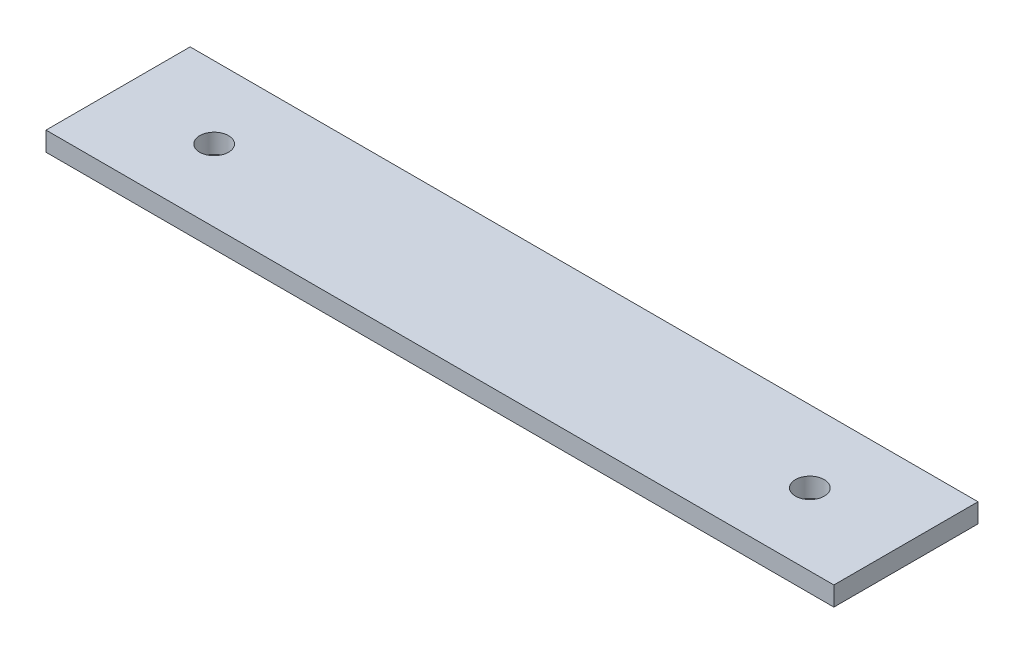
ISO-10303-21;
HEADER;
FILE_DESCRIPTION(('STEP AP214'),'2;1');
FILE_NAME('part.step','',(''),(''),'','','');
FILE_SCHEMA(('AUTOMOTIVE_DESIGN { 1 0 10303 214 1 1 1 1 }'));
ENDSEC;
DATA;
#1=APPLICATION_CONTEXT('core data for automotive mechanical design processes');
#2=APPLICATION_PROTOCOL_DEFINITION('international standard','automotive_design',2000,#1);
#3=PRODUCT_CONTEXT('',#1,'mechanical');
#4=PRODUCT('Part','Part','',(#3));
#5=PRODUCT_RELATED_PRODUCT_CATEGORY('part','',(#4));
#6=PRODUCT_DEFINITION_FORMATION('','',#4);
#7=PRODUCT_DEFINITION_CONTEXT('part definition',#1,'design');
#8=PRODUCT_DEFINITION('design','',#6,#7);
#9=PRODUCT_DEFINITION_SHAPE('','',#8);
#10=(LENGTH_UNIT() NAMED_UNIT(*) SI_UNIT(.MILLI.,.METRE.));
#11=(NAMED_UNIT(*) PLANE_ANGLE_UNIT() SI_UNIT($,.RADIAN.));
#12=(NAMED_UNIT(*) SI_UNIT($,.STERADIAN.) SOLID_ANGLE_UNIT());
#13=UNCERTAINTY_MEASURE_WITH_UNIT(LENGTH_MEASURE(1.E-05),#10,'distance_accuracy_value','');
#14=(GEOMETRIC_REPRESENTATION_CONTEXT(3) GLOBAL_UNCERTAINTY_ASSIGNED_CONTEXT((#13)) GLOBAL_UNIT_ASSIGNED_CONTEXT((#10,
#11,#12)) REPRESENTATION_CONTEXT('',''));
#15=CARTESIAN_POINT('',(0.,0.,0.));
#16=DIRECTION('',(0.,0.,1.));
#17=DIRECTION('',(1.,0.,0.));
#18=AXIS2_PLACEMENT_3D('',#15,#16,#17);
#19=CARTESIAN_POINT('',(0.,2.,0.));
#20=DIRECTION('',(0.,-1.,0.));
#21=DIRECTION('',(0.,0.,-1.));
#22=AXIS2_PLACEMENT_3D('',#19,#20,#21);
#23=PLANE('',#22);
#24=DIRECTION('',(0.,0.,1.));
#25=VECTOR('',#24,1.);
#26=CARTESIAN_POINT('',(0.,2.,0.));
#27=LINE('',#26,#25);
#28=CARTESIAN_POINT('',(0.,2.,-15.));
#29=VERTEX_POINT('',#28);
#30=CARTESIAN_POINT('',(0.,2.,0.));
#31=VERTEX_POINT('',#30);
#32=EDGE_CURVE('E85',#29,#31,#27,.T.);
#33=ORIENTED_EDGE('',*,*,#32,.T.);
#34=DIRECTION('',(1.,0.,0.));
#35=VECTOR('',#34,1.);
#36=CARTESIAN_POINT('',(0.,2.,0.));
#37=LINE('',#36,#35);
#38=CARTESIAN_POINT('',(82.,2.,0.));
#39=VERTEX_POINT('',#38);
#40=EDGE_CURVE('E80',#31,#39,#37,.T.);
#41=ORIENTED_EDGE('',*,*,#40,.T.);
#42=DIRECTION('',(0.,0.,-1.));
#43=VECTOR('',#42,1.);
#44=CARTESIAN_POINT('',(82.,2.,0.));
#45=LINE('',#44,#43);
#46=CARTESIAN_POINT('',(82.,2.,-15.));
#47=VERTEX_POINT('',#46);
#48=EDGE_CURVE('E83',#39,#47,#45,.T.);
#49=ORIENTED_EDGE('',*,*,#48,.T.);
#50=DIRECTION('',(-1.,0.,0.));
#51=VECTOR('',#50,1.);
#52=CARTESIAN_POINT('',(0.,2.,-15.));
#53=LINE('',#52,#51);
#54=EDGE_CURVE('E50',#47,#29,#53,.T.);
#55=ORIENTED_EDGE('',*,*,#54,.T.);
#56=EDGE_LOOP('',(#33,#41,#49,#55));
#57=FACE_BOUND('',#56,.T.);
#58=CARTESIAN_POINT('',(10.,2.,-7.5));
#59=DIRECTION('',(0.,1.,0.));
#60=DIRECTION('',(0.,0.,1.));
#61=AXIS2_PLACEMENT_3D('',#58,#59,#60);
#62=CIRCLE('',#61,1.5);
#63=CARTESIAN_POINT('',(10.,2.,-6.));
#64=VERTEX_POINT('',#63);
#65=EDGE_CURVE('E100',#64,#64,#62,.T.);
#66=ORIENTED_EDGE('',*,*,#65,.F.);
#67=EDGE_LOOP('',(#66));
#68=FACE_BOUND('',#67,.T.);
#69=CARTESIAN_POINT('',(72.,2.,-7.5));
#70=DIRECTION('',(0.,1.,0.));
#71=DIRECTION('',(0.,0.,1.));
#72=AXIS2_PLACEMENT_3D('',#69,#70,#71);
#73=CIRCLE('',#72,1.5);
#74=CARTESIAN_POINT('',(72.,2.,-6.));
#75=VERTEX_POINT('',#74);
#76=EDGE_CURVE('E115',#75,#75,#73,.T.);
#77=ORIENTED_EDGE('',*,*,#76,.F.);
#78=EDGE_LOOP('',(#77));
#79=FACE_BOUND('',#78,.T.);
#80=ADVANCED_FACE('F33',(#57,#68,#79),#23,.F.);
#81=CARTESIAN_POINT('',(0.,0.,0.));
#82=DIRECTION('',(0.,-1.,0.));
#83=DIRECTION('',(0.,0.,-1.));
#84=AXIS2_PLACEMENT_3D('',#81,#82,#83);
#85=PLANE('',#84);
#86=CARTESIAN_POINT('',(10.,0.,-7.5));
#87=DIRECTION('',(0.,1.,0.));
#88=DIRECTION('',(0.,0.,1.));
#89=AXIS2_PLACEMENT_3D('',#86,#87,#88);
#90=CIRCLE('',#89,1.5);
#91=CARTESIAN_POINT('',(10.,0.,-6.));
#92=VERTEX_POINT('',#91);
#93=EDGE_CURVE('E112',#92,#92,#90,.T.);
#94=ORIENTED_EDGE('',*,*,#93,.T.);
#95=EDGE_LOOP('',(#94));
#96=FACE_BOUND('',#95,.T.);
#97=DIRECTION('',(0.,0.,1.));
#98=VECTOR('',#97,1.);
#99=CARTESIAN_POINT('',(0.,0.,0.));
#100=LINE('',#99,#98);
#101=CARTESIAN_POINT('',(0.,0.,-15.));
#102=VERTEX_POINT('',#101);
#103=CARTESIAN_POINT('',(0.,0.,0.));
#104=VERTEX_POINT('',#103);
#105=EDGE_CURVE('E97',#102,#104,#100,.T.);
#106=ORIENTED_EDGE('',*,*,#105,.F.);
#107=DIRECTION('',(-1.,0.,0.));
#108=VECTOR('',#107,1.);
#109=CARTESIAN_POINT('',(0.,0.,-15.));
#110=LINE('',#109,#108);
#111=CARTESIAN_POINT('',(82.,0.,-15.));
#112=VERTEX_POINT('',#111);
#113=EDGE_CURVE('E73',#112,#102,#110,.T.);
#114=ORIENTED_EDGE('',*,*,#113,.F.);
#115=DIRECTION('',(0.,0.,-1.));
#116=VECTOR('',#115,1.);
#117=CARTESIAN_POINT('',(82.,0.,0.));
#118=LINE('',#117,#116);
#119=CARTESIAN_POINT('',(82.,0.,0.));
#120=VERTEX_POINT('',#119);
#121=EDGE_CURVE('E67',#120,#112,#118,.T.);
#122=ORIENTED_EDGE('',*,*,#121,.F.);
#123=DIRECTION('',(1.,0.,0.));
#124=VECTOR('',#123,1.);
#125=CARTESIAN_POINT('',(0.,0.,0.));
#126=LINE('',#125,#124);
#127=EDGE_CURVE('E89',#104,#120,#126,.T.);
#128=ORIENTED_EDGE('',*,*,#127,.F.);
#129=EDGE_LOOP('',(#106,#114,#122,#128));
#130=FACE_BOUND('',#129,.T.);
#131=CARTESIAN_POINT('',(72.,0.,-7.5));
#132=DIRECTION('',(0.,1.,0.));
#133=DIRECTION('',(0.,0.,1.));
#134=AXIS2_PLACEMENT_3D('',#131,#132,#133);
#135=CIRCLE('',#134,1.5);
#136=CARTESIAN_POINT('',(72.,0.,-6.));
#137=VERTEX_POINT('',#136);
#138=EDGE_CURVE('E118',#137,#137,#135,.T.);
#139=ORIENTED_EDGE('',*,*,#138,.T.);
#140=EDGE_LOOP('',(#139));
#141=FACE_BOUND('',#140,.T.);
#142=ADVANCED_FACE('F108',(#96,#130,#141),#85,.T.);
#143=CARTESIAN_POINT('',(0.,2.,0.));
#144=DIRECTION('',(1.,0.,0.));
#145=DIRECTION('',(0.,0.,-1.));
#146=AXIS2_PLACEMENT_3D('',#143,#144,#145);
#147=PLANE('',#146);
#148=ORIENTED_EDGE('',*,*,#105,.T.);
#149=DIRECTION('',(0.,-1.,0.));
#150=VECTOR('',#149,1.);
#151=CARTESIAN_POINT('',(0.,2.,0.));
#152=LINE('',#151,#150);
#153=EDGE_CURVE('E11',#31,#104,#152,.T.);
#154=ORIENTED_EDGE('',*,*,#153,.F.);
#155=ORIENTED_EDGE('',*,*,#32,.F.);
#156=DIRECTION('',(0.,-1.,0.));
#157=VECTOR('',#156,1.);
#158=CARTESIAN_POINT('',(0.,2.,-15.));
#159=LINE('',#158,#157);
#160=EDGE_CURVE('E93',#29,#102,#159,.T.);
#161=ORIENTED_EDGE('',*,*,#160,.T.);
#162=EDGE_LOOP('',(#148,#154,#155,#161));
#163=FACE_BOUND('',#162,.T.);
#164=ADVANCED_FACE('F35',(#163),#147,.F.);
#165=CARTESIAN_POINT('',(0.,2.,0.));
#166=DIRECTION('',(0.,0.,-1.));
#167=DIRECTION('',(-1.,0.,0.));
#168=AXIS2_PLACEMENT_3D('',#165,#166,#167);
#169=PLANE('',#168);
#170=ORIENTED_EDGE('',*,*,#127,.T.);
#171=DIRECTION('',(0.,-1.,0.));
#172=VECTOR('',#171,1.);
#173=CARTESIAN_POINT('',(82.,2.,0.));
#174=LINE('',#173,#172);
#175=EDGE_CURVE('E42',#39,#120,#174,.T.);
#176=ORIENTED_EDGE('',*,*,#175,.F.);
#177=ORIENTED_EDGE('',*,*,#40,.F.);
#178=ORIENTED_EDGE('',*,*,#153,.T.);
#179=EDGE_LOOP('',(#170,#176,#177,#178));
#180=FACE_BOUND('',#179,.T.);
#181=ADVANCED_FACE('F88',(#180),#169,.F.);
#182=CARTESIAN_POINT('',(82.,2.,0.));
#183=DIRECTION('',(-1.,0.,0.));
#184=DIRECTION('',(0.,0.,1.));
#185=AXIS2_PLACEMENT_3D('',#182,#183,#184);
#186=PLANE('',#185);
#187=ORIENTED_EDGE('',*,*,#121,.T.);
#188=DIRECTION('',(0.,-1.,0.));
#189=VECTOR('',#188,1.);
#190=CARTESIAN_POINT('',(82.,2.,-15.));
#191=LINE('',#190,#189);
#192=EDGE_CURVE('E90',#47,#112,#191,.T.);
#193=ORIENTED_EDGE('',*,*,#192,.F.);
#194=ORIENTED_EDGE('',*,*,#48,.F.);
#195=ORIENTED_EDGE('',*,*,#175,.T.);
#196=EDGE_LOOP('',(#187,#193,#194,#195));
#197=FACE_BOUND('',#196,.T.);
#198=ADVANCED_FACE('F91',(#197),#186,.F.);
#199=CARTESIAN_POINT('',(0.,2.,-15.));
#200=DIRECTION('',(0.,0.,1.));
#201=DIRECTION('',(1.,0.,0.));
#202=AXIS2_PLACEMENT_3D('',#199,#200,#201);
#203=PLANE('',#202);
#204=ORIENTED_EDGE('',*,*,#113,.T.);
#205=ORIENTED_EDGE('',*,*,#160,.F.);
#206=ORIENTED_EDGE('',*,*,#54,.F.);
#207=ORIENTED_EDGE('',*,*,#192,.T.);
#208=EDGE_LOOP('',(#204,#205,#206,#207));
#209=FACE_BOUND('',#208,.T.);
#210=ADVANCED_FACE('F105',(#209),#203,.F.);
#211=CARTESIAN_POINT('',(10.,2.,-7.5));
#212=DIRECTION('',(0.,-1.,0.));
#213=DIRECTION('',(0.,0.,-1.));
#214=AXIS2_PLACEMENT_3D('',#211,#212,#213);
#215=CYLINDRICAL_SURFACE('',#214,1.5);
#216=ORIENTED_EDGE('',*,*,#65,.T.);
#217=EDGE_LOOP('',(#216));
#218=FACE_BOUND('',#217,.T.);
#219=ORIENTED_EDGE('',*,*,#93,.F.);
#220=EDGE_LOOP('',(#219));
#221=FACE_BOUND('',#220,.T.);
#222=ADVANCED_FACE('F135',(#218,#221),#215,.F.);
#223=CARTESIAN_POINT('',(72.,2.,-7.5));
#224=DIRECTION('',(0.,-1.,0.));
#225=DIRECTION('',(0.,0.,-1.));
#226=AXIS2_PLACEMENT_3D('',#223,#224,#225);
#227=CYLINDRICAL_SURFACE('',#226,1.5);
#228=ORIENTED_EDGE('',*,*,#76,.T.);
#229=EDGE_LOOP('',(#228));
#230=FACE_BOUND('',#229,.T.);
#231=ORIENTED_EDGE('',*,*,#138,.F.);
#232=EDGE_LOOP('',(#231));
#233=FACE_BOUND('',#232,.T.);
#234=ADVANCED_FACE('F124',(#230,#233),#227,.F.);
#235=CLOSED_SHELL('',(#80,#142,#164,#181,#198,#210,#222,#234));
#236=MANIFOLD_SOLID_BREP('B2',#235);
#237=ADVANCED_BREP_SHAPE_REPRESENTATION('',(#18,#236),#14);
#238=SHAPE_DEFINITION_REPRESENTATION(#9,#237);
ENDSEC;
END-ISO-10303-21;
